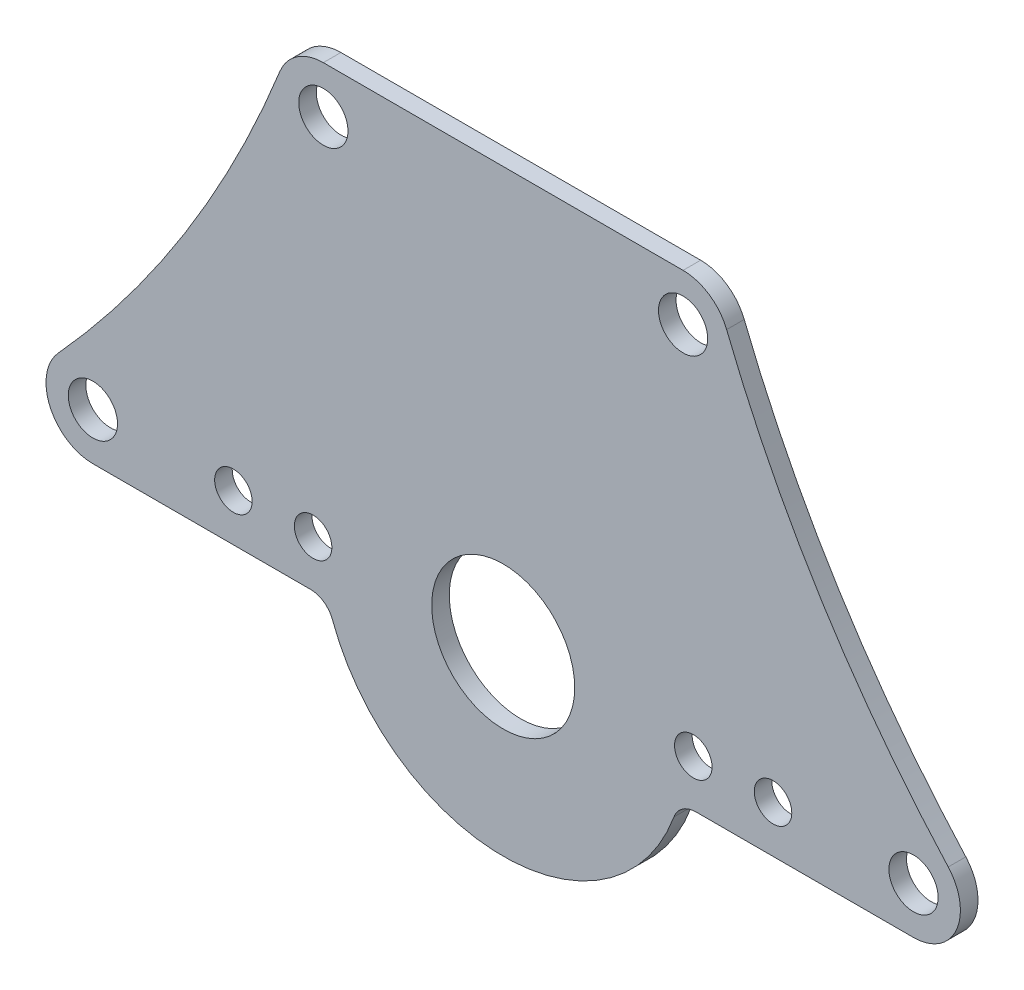
ISO-10303-21;
HEADER;
FILE_DESCRIPTION(('STEP AP214'),'2;1');
FILE_NAME('part.step','',(''),(''),'','','');
FILE_SCHEMA(('AUTOMOTIVE_DESIGN { 1 0 10303 214 1 1 1 1 }'));
ENDSEC;
DATA;
#1=APPLICATION_CONTEXT('core data for automotive mechanical design processes');
#2=APPLICATION_PROTOCOL_DEFINITION('international standard','automotive_design',2000,#1);
#3=PRODUCT_CONTEXT('',#1,'mechanical');
#4=PRODUCT('Part','Part','',(#3));
#5=PRODUCT_RELATED_PRODUCT_CATEGORY('part','',(#4));
#6=PRODUCT_DEFINITION_FORMATION('','',#4);
#7=PRODUCT_DEFINITION_CONTEXT('part definition',#1,'design');
#8=PRODUCT_DEFINITION('design','',#6,#7);
#9=PRODUCT_DEFINITION_SHAPE('','',#8);
#10=(LENGTH_UNIT() NAMED_UNIT(*) SI_UNIT(.MILLI.,.METRE.));
#11=(NAMED_UNIT(*) PLANE_ANGLE_UNIT() SI_UNIT($,.RADIAN.));
#12=(NAMED_UNIT(*) SI_UNIT($,.STERADIAN.) SOLID_ANGLE_UNIT());
#13=UNCERTAINTY_MEASURE_WITH_UNIT(LENGTH_MEASURE(1.E-05),#10,'distance_accuracy_value','');
#14=(GEOMETRIC_REPRESENTATION_CONTEXT(3) GLOBAL_UNCERTAINTY_ASSIGNED_CONTEXT((#13)) GLOBAL_UNIT_ASSIGNED_CONTEXT((#10,
#11,#12)) REPRESENTATION_CONTEXT('',''));
#15=CARTESIAN_POINT('',(0.,0.,0.));
#16=DIRECTION('',(0.,0.,1.));
#17=DIRECTION('',(1.,0.,0.));
#18=AXIS2_PLACEMENT_3D('',#15,#16,#17);
#19=CARTESIAN_POINT('',(0.,-20.,1.5));
#20=DIRECTION('',(0.,0.,-1.));
#21=DIRECTION('',(-1.,0.,0.));
#22=AXIS2_PLACEMENT_3D('',#19,#20,#21);
#23=CYLINDRICAL_SURFACE('',#22,15.5);
#24=CARTESIAN_POINT('',(0.,-20.,0.));
#25=DIRECTION('',(0.,0.,1.));
#26=DIRECTION('',(1.,0.,0.));
#27=AXIS2_PLACEMENT_3D('',#24,#25,#26);
#28=CIRCLE('',#27,15.5);
#29=CARTESIAN_POINT('',(-14.5605071115995,-25.3142857142857,0.));
#30=VERTEX_POINT('',#29);
#31=CARTESIAN_POINT('',(14.5605071115995,-25.3142857142857,0.));
#32=VERTEX_POINT('',#31);
#33=EDGE_CURVE('E220',#30,#32,#28,.T.);
#34=ORIENTED_EDGE('',*,*,#33,.T.);
#35=DIRECTION('',(0.,0.,-1.));
#36=VECTOR('',#35,1.);
#37=CARTESIAN_POINT('',(14.5605071115995,-25.3142857142857,1.5));
#38=LINE('',#37,#36);
#39=CARTESIAN_POINT('',(14.5605071115995,-25.3142857142857,1.5));
#40=VERTEX_POINT('',#39);
#41=EDGE_CURVE('E282',#32,#40,#38,.F.);
#42=ORIENTED_EDGE('',*,*,#41,.T.);
#43=CARTESIAN_POINT('',(0.,-20.,1.5));
#44=DIRECTION('',(0.,0.,1.));
#45=DIRECTION('',(1.,0.,0.));
#46=AXIS2_PLACEMENT_3D('',#43,#44,#45);
#47=CIRCLE('',#46,15.5);
#48=CARTESIAN_POINT('',(-14.5605071115995,-25.3142857142857,1.5));
#49=VERTEX_POINT('',#48);
#50=EDGE_CURVE('E139',#49,#40,#47,.T.);
#51=ORIENTED_EDGE('',*,*,#50,.F.);
#52=DIRECTION('',(0.,0.,-1.));
#53=VECTOR('',#52,1.);
#54=CARTESIAN_POINT('',(-14.5605071115995,-25.3142857142857,1.5));
#55=LINE('',#54,#53);
#56=EDGE_CURVE('E289',#49,#30,#55,.T.);
#57=ORIENTED_EDGE('',*,*,#56,.T.);
#58=EDGE_LOOP('',(#34,#42,#51,#57));
#59=FACE_BOUND('',#58,.T.);
#60=ADVANCED_FACE('F37',(#59),#23,.T.);
#61=CARTESIAN_POINT('',(0.,-24.,1.5));
#62=DIRECTION('',(0.,1.,0.));
#63=DIRECTION('',(-1.,0.,0.));
#64=AXIS2_PLACEMENT_3D('',#61,#62,#63);
#65=PLANE('',#64);
#66=DIRECTION('',(1.,0.,0.));
#67=VECTOR('',#66,1.);
#68=CARTESIAN_POINT('',(0.,-24.,1.5));
#69=LINE('',#68,#67);
#70=CARTESIAN_POINT('',(16.4392822227736,-24.,1.5));
#71=VERTEX_POINT('',#70);
#72=CARTESIAN_POINT('',(35.,-24.,1.5));
#73=VERTEX_POINT('',#72);
#74=EDGE_CURVE('E125',#71,#73,#69,.T.);
#75=ORIENTED_EDGE('',*,*,#74,.F.);
#76=DIRECTION('',(0.,0.,1.));
#77=VECTOR('',#76,1.);
#78=CARTESIAN_POINT('',(16.4392822227736,-24.,0.));
#79=LINE('',#78,#77);
#80=CARTESIAN_POINT('',(16.4392822227736,-24.,0.));
#81=VERTEX_POINT('',#80);
#82=EDGE_CURVE('E149',#71,#81,#79,.F.);
#83=ORIENTED_EDGE('',*,*,#82,.T.);
#84=DIRECTION('',(1.,0.,0.));
#85=VECTOR('',#84,1.);
#86=CARTESIAN_POINT('',(0.,-24.,0.));
#87=LINE('',#86,#85);
#88=CARTESIAN_POINT('',(35.,-24.,0.));
#89=VERTEX_POINT('',#88);
#90=EDGE_CURVE('E145',#81,#89,#87,.T.);
#91=ORIENTED_EDGE('',*,*,#90,.T.);
#92=DIRECTION('',(0.,0.,-1.));
#93=VECTOR('',#92,1.);
#94=CARTESIAN_POINT('',(35.,-24.,1.5));
#95=LINE('',#94,#93);
#96=EDGE_CURVE('E142',#73,#89,#95,.T.);
#97=ORIENTED_EDGE('',*,*,#96,.F.);
#98=EDGE_LOOP('',(#75,#83,#91,#97));
#99=FACE_BOUND('',#98,.T.);
#100=ADVANCED_FACE('F143',(#99),#65,.F.);
#101=CARTESIAN_POINT('',(35.,-20.,1.5));
#102=DIRECTION('',(0.,0.,-1.));
#103=DIRECTION('',(-1.,0.,0.));
#104=AXIS2_PLACEMENT_3D('',#101,#102,#103);
#105=CYLINDRICAL_SURFACE('',#104,4.00000000000001);
#106=CARTESIAN_POINT('',(35.,-20.,0.));
#107=DIRECTION('',(0.,0.,1.));
#108=DIRECTION('',(1.,0.,0.));
#109=AXIS2_PLACEMENT_3D('',#106,#107,#108);
#110=CIRCLE('',#109,4.00000000000001);
#111=CARTESIAN_POINT('',(37.9597935701072,-17.3093454286453,0.));
#112=VERTEX_POINT('',#111);
#113=EDGE_CURVE('E341',#89,#112,#110,.T.);
#114=ORIENTED_EDGE('',*,*,#113,.T.);
#115=DIRECTION('',(0.,0.,-1.));
#116=VECTOR('',#115,1.);
#117=CARTESIAN_POINT('',(37.9597935701072,-17.3093454286453,1.5));
#118=LINE('',#117,#116);
#119=CARTESIAN_POINT('',(37.9597935701072,-17.3093454286453,1.5));
#120=VERTEX_POINT('',#119);
#121=EDGE_CURVE('E150',#120,#112,#118,.T.);
#122=ORIENTED_EDGE('',*,*,#121,.F.);
#123=CARTESIAN_POINT('',(35.,-20.,1.5));
#124=DIRECTION('',(0.,0.,1.));
#125=DIRECTION('',(1.,0.,0.));
#126=AXIS2_PLACEMENT_3D('',#123,#124,#125);
#127=CIRCLE('',#126,4.00000000000001);
#128=EDGE_CURVE('E131',#73,#120,#127,.T.);
#129=ORIENTED_EDGE('',*,*,#128,.F.);
#130=ORIENTED_EDGE('',*,*,#96,.T.);
#131=EDGE_LOOP('',(#114,#122,#129,#130));
#132=FACE_BOUND('',#131,.T.);
#133=ADVANCED_FACE('F152',(#132),#105,.T.);
#134=CARTESIAN_POINT('',(111.954632822788,49.9570188552223,1.5));
#135=DIRECTION('',(0.,0.,-1.));
#136=DIRECTION('',(-1.,0.,0.));
#137=AXIS2_PLACEMENT_3D('',#134,#135,#136);
#138=CYLINDRICAL_SURFACE('',#137,100.);
#139=CARTESIAN_POINT('',(111.954632822788,49.9570188552223,0.));
#140=DIRECTION('',(0.,0.,1.));
#141=DIRECTION('',(1.,0.,0.));
#142=AXIS2_PLACEMENT_3D('',#139,#140,#141);
#143=CIRCLE('',#142,100.);
#144=CARTESIAN_POINT('',(19.0588225485857,12.9385311294998,0.));
#145=VERTEX_POINT('',#144);
#146=EDGE_CURVE('E338',#145,#112,#143,.T.);
#147=ORIENTED_EDGE('',*,*,#146,.F.);
#148=DIRECTION('',(0.,0.,-1.));
#149=VECTOR('',#148,1.);
#150=CARTESIAN_POINT('',(19.0588225485857,12.9385311294998,1.5));
#151=LINE('',#150,#149);
#152=CARTESIAN_POINT('',(19.0588225485857,12.9385311294998,1.5));
#153=VERTEX_POINT('',#152);
#154=EDGE_CURVE('E294',#153,#145,#151,.T.);
#155=ORIENTED_EDGE('',*,*,#154,.F.);
#156=CARTESIAN_POINT('',(111.954632822788,49.9570188552223,1.5));
#157=DIRECTION('',(0.,0.,1.));
#158=DIRECTION('',(1.,0.,0.));
#159=AXIS2_PLACEMENT_3D('',#156,#157,#158);
#160=CIRCLE('',#159,100.);
#161=EDGE_CURVE('E154',#153,#120,#160,.T.);
#162=ORIENTED_EDGE('',*,*,#161,.T.);
#163=ORIENTED_EDGE('',*,*,#121,.T.);
#164=EDGE_LOOP('',(#147,#155,#162,#163));
#165=FACE_BOUND('',#164,.T.);
#166=ADVANCED_FACE('F413',(#165),#138,.F.);
#167=CARTESIAN_POINT('',(15.3429901376176,11.4577916204709,1.5));
#168=DIRECTION('',(0.,0.,-1.));
#169=DIRECTION('',(-1.,0.,0.));
#170=AXIS2_PLACEMENT_3D('',#167,#168,#169);
#171=CYLINDRICAL_SURFACE('',#170,4.00000000000002);
#172=CARTESIAN_POINT('',(15.3429901376176,11.4577916204709,0.));
#173=DIRECTION('',(0.,0.,1.));
#174=DIRECTION('',(1.,0.,0.));
#175=AXIS2_PLACEMENT_3D('',#172,#173,#174);
#176=CIRCLE('',#175,4.00000000000002);
#177=CARTESIAN_POINT('',(15.3429901376176,15.4577916204709,0.));
#178=VERTEX_POINT('',#177);
#179=EDGE_CURVE('E335',#145,#178,#176,.T.);
#180=ORIENTED_EDGE('',*,*,#179,.T.);
#181=DIRECTION('',(0.,0.,-1.));
#182=VECTOR('',#181,1.);
#183=CARTESIAN_POINT('',(15.3429901376176,15.4577916204709,1.5));
#184=LINE('',#183,#182);
#185=CARTESIAN_POINT('',(15.3429901376176,15.4577916204709,1.5));
#186=VERTEX_POINT('',#185);
#187=EDGE_CURVE('E296',#186,#178,#184,.T.);
#188=ORIENTED_EDGE('',*,*,#187,.F.);
#189=CARTESIAN_POINT('',(15.3429901376176,11.4577916204709,1.5));
#190=DIRECTION('',(0.,0.,1.));
#191=DIRECTION('',(1.,0.,0.));
#192=AXIS2_PLACEMENT_3D('',#189,#190,#191);
#193=CIRCLE('',#192,4.00000000000002);
#194=EDGE_CURVE('E156',#153,#186,#193,.T.);
#195=ORIENTED_EDGE('',*,*,#194,.F.);
#196=ORIENTED_EDGE('',*,*,#154,.T.);
#197=EDGE_LOOP('',(#180,#188,#195,#196));
#198=FACE_BOUND('',#197,.T.);
#199=ADVANCED_FACE('F409',(#198),#171,.T.);
#200=CARTESIAN_POINT('',(0.,15.4577916204709,1.5));
#201=DIRECTION('',(0.,1.,0.));
#202=DIRECTION('',(0.,0.,1.));
#203=AXIS2_PLACEMENT_3D('',#200,#201,#202);
#204=PLANE('',#203);
#205=DIRECTION('',(1.,0.,0.));
#206=VECTOR('',#205,1.);
#207=CARTESIAN_POINT('',(0.,15.4577916204709,0.));
#208=LINE('',#207,#206);
#209=CARTESIAN_POINT('',(-15.3429901376176,15.4577916204709,0.));
#210=VERTEX_POINT('',#209);
#211=EDGE_CURVE('E332',#210,#178,#208,.T.);
#212=ORIENTED_EDGE('',*,*,#211,.F.);
#213=DIRECTION('',(0.,0.,-1.));
#214=VECTOR('',#213,1.);
#215=CARTESIAN_POINT('',(-15.3429901376176,15.4577916204709,1.5));
#216=LINE('',#215,#214);
#217=CARTESIAN_POINT('',(-15.3429901376176,15.4577916204709,1.5));
#218=VERTEX_POINT('',#217);
#219=EDGE_CURVE('E298',#218,#210,#216,.T.);
#220=ORIENTED_EDGE('',*,*,#219,.F.);
#221=DIRECTION('',(1.,0.,0.));
#222=VECTOR('',#221,1.);
#223=CARTESIAN_POINT('',(0.,15.4577916204709,1.5));
#224=LINE('',#223,#222);
#225=EDGE_CURVE('E172',#218,#186,#224,.T.);
#226=ORIENTED_EDGE('',*,*,#225,.T.);
#227=ORIENTED_EDGE('',*,*,#187,.T.);
#228=EDGE_LOOP('',(#212,#220,#226,#227));
#229=FACE_BOUND('',#228,.T.);
#230=ADVANCED_FACE('F405',(#229),#204,.T.);
#231=CARTESIAN_POINT('',(-15.3429901376176,11.4577916204709,1.5));
#232=DIRECTION('',(0.,0.,-1.));
#233=DIRECTION('',(-1.,0.,0.));
#234=AXIS2_PLACEMENT_3D('',#231,#232,#233);
#235=CYLINDRICAL_SURFACE('',#234,4.00000000000002);
#236=CARTESIAN_POINT('',(-15.3429901376176,11.4577916204709,0.));
#237=DIRECTION('',(0.,0.,1.));
#238=DIRECTION('',(1.,0.,0.));
#239=AXIS2_PLACEMENT_3D('',#236,#237,#238);
#240=CIRCLE('',#239,4.00000000000002);
#241=CARTESIAN_POINT('',(-19.0588225485857,12.9385311294998,0.));
#242=VERTEX_POINT('',#241);
#243=EDGE_CURVE('E329',#242,#210,#240,.F.);
#244=ORIENTED_EDGE('',*,*,#243,.F.);
#245=DIRECTION('',(0.,0.,-1.));
#246=VECTOR('',#245,1.);
#247=CARTESIAN_POINT('',(-19.0588225485857,12.9385311294998,1.5));
#248=LINE('',#247,#246);
#249=CARTESIAN_POINT('',(-19.0588225485857,12.9385311294998,1.5));
#250=VERTEX_POINT('',#249);
#251=EDGE_CURVE('E300',#250,#242,#248,.T.);
#252=ORIENTED_EDGE('',*,*,#251,.F.);
#253=CARTESIAN_POINT('',(-15.3429901376176,11.4577916204709,1.5));
#254=DIRECTION('',(0.,0.,1.));
#255=DIRECTION('',(1.,0.,0.));
#256=AXIS2_PLACEMENT_3D('',#253,#254,#255);
#257=CIRCLE('',#256,4.00000000000002);
#258=EDGE_CURVE('E176',#250,#218,#257,.F.);
#259=ORIENTED_EDGE('',*,*,#258,.T.);
#260=ORIENTED_EDGE('',*,*,#219,.T.);
#261=EDGE_LOOP('',(#244,#252,#259,#260));
#262=FACE_BOUND('',#261,.T.);
#263=ADVANCED_FACE('F401',(#262),#235,.T.);
#264=CARTESIAN_POINT('',(-111.954632822788,49.9570188552223,1.5));
#265=DIRECTION('',(0.,0.,-1.));
#266=DIRECTION('',(-1.,0.,0.));
#267=AXIS2_PLACEMENT_3D('',#264,#265,#266);
#268=CYLINDRICAL_SURFACE('',#267,100.);
#269=CARTESIAN_POINT('',(-111.954632822788,49.9570188552223,0.));
#270=DIRECTION('',(0.,0.,1.));
#271=DIRECTION('',(1.,0.,0.));
#272=AXIS2_PLACEMENT_3D('',#269,#270,#271);
#273=CIRCLE('',#272,100.);
#274=CARTESIAN_POINT('',(-37.9597935701072,-17.3093454286453,0.));
#275=VERTEX_POINT('',#274);
#276=EDGE_CURVE('E326',#242,#275,#273,.F.);
#277=ORIENTED_EDGE('',*,*,#276,.T.);
#278=DIRECTION('',(0.,0.,-1.));
#279=VECTOR('',#278,1.);
#280=CARTESIAN_POINT('',(-37.9597935701072,-17.3093454286453,1.5));
#281=LINE('',#280,#279);
#282=CARTESIAN_POINT('',(-37.9597935701072,-17.3093454286453,1.5));
#283=VERTEX_POINT('',#282);
#284=EDGE_CURVE('E302',#283,#275,#281,.T.);
#285=ORIENTED_EDGE('',*,*,#284,.F.);
#286=CARTESIAN_POINT('',(-111.954632822788,49.9570188552223,1.5));
#287=DIRECTION('',(0.,0.,1.));
#288=DIRECTION('',(1.,0.,0.));
#289=AXIS2_PLACEMENT_3D('',#286,#287,#288);
#290=CIRCLE('',#289,100.);
#291=EDGE_CURVE('E179',#250,#283,#290,.F.);
#292=ORIENTED_EDGE('',*,*,#291,.F.);
#293=ORIENTED_EDGE('',*,*,#251,.T.);
#294=EDGE_LOOP('',(#277,#285,#292,#293));
#295=FACE_BOUND('',#294,.T.);
#296=ADVANCED_FACE('F397',(#295),#268,.F.);
#297=CARTESIAN_POINT('',(-35.,-20.,1.5));
#298=DIRECTION('',(0.,0.,-1.));
#299=DIRECTION('',(-1.,0.,0.));
#300=AXIS2_PLACEMENT_3D('',#297,#298,#299);
#301=CYLINDRICAL_SURFACE('',#300,4.00000000000001);
#302=CARTESIAN_POINT('',(-35.,-20.,0.));
#303=DIRECTION('',(0.,0.,1.));
#304=DIRECTION('',(1.,0.,0.));
#305=AXIS2_PLACEMENT_3D('',#302,#303,#304);
#306=CIRCLE('',#305,4.00000000000001);
#307=CARTESIAN_POINT('',(-35.,-24.,0.));
#308=VERTEX_POINT('',#307);
#309=EDGE_CURVE('E323',#308,#275,#306,.F.);
#310=ORIENTED_EDGE('',*,*,#309,.F.);
#311=DIRECTION('',(0.,0.,-1.));
#312=VECTOR('',#311,1.);
#313=CARTESIAN_POINT('',(-35.,-24.,1.5));
#314=LINE('',#313,#312);
#315=CARTESIAN_POINT('',(-35.,-24.,1.5));
#316=VERTEX_POINT('',#315);
#317=EDGE_CURVE('E304',#316,#308,#314,.T.);
#318=ORIENTED_EDGE('',*,*,#317,.F.);
#319=CARTESIAN_POINT('',(-35.,-20.,1.5));
#320=DIRECTION('',(0.,0.,1.));
#321=DIRECTION('',(1.,0.,0.));
#322=AXIS2_PLACEMENT_3D('',#319,#320,#321);
#323=CIRCLE('',#322,4.00000000000001);
#324=EDGE_CURVE('E181',#316,#283,#323,.F.);
#325=ORIENTED_EDGE('',*,*,#324,.T.);
#326=ORIENTED_EDGE('',*,*,#284,.T.);
#327=EDGE_LOOP('',(#310,#318,#325,#326));
#328=FACE_BOUND('',#327,.T.);
#329=ADVANCED_FACE('F384',(#328),#301,.T.);
#330=CARTESIAN_POINT('',(35.,-20.,1.5));
#331=DIRECTION('',(0.,0.,-1.));
#332=DIRECTION('',(-1.,0.,0.));
#333=AXIS2_PLACEMENT_3D('',#330,#331,#332);
#334=CYLINDRICAL_SURFACE('',#333,2.1);
#335=CARTESIAN_POINT('',(35.,-20.,1.5));
#336=DIRECTION('',(0.,0.,1.));
#337=DIRECTION('',(1.,0.,0.));
#338=AXIS2_PLACEMENT_3D('',#335,#336,#337);
#339=CIRCLE('',#338,2.1);
#340=CARTESIAN_POINT('',(37.1,-20.,1.5));
#341=VERTEX_POINT('',#340);
#342=EDGE_CURVE('E346',#341,#341,#339,.T.);
#343=ORIENTED_EDGE('',*,*,#342,.T.);
#344=EDGE_LOOP('',(#343));
#345=FACE_BOUND('',#344,.T.);
#346=CARTESIAN_POINT('',(35.,-20.,0.));
#347=DIRECTION('',(0.,0.,1.));
#348=DIRECTION('',(1.,0.,0.));
#349=AXIS2_PLACEMENT_3D('',#346,#347,#348);
#350=CIRCLE('',#349,2.1);
#351=CARTESIAN_POINT('',(37.1,-20.,0.));
#352=VERTEX_POINT('',#351);
#353=EDGE_CURVE('E309',#352,#352,#350,.T.);
#354=ORIENTED_EDGE('',*,*,#353,.F.);
#355=EDGE_LOOP('',(#354));
#356=FACE_BOUND('',#355,.T.);
#357=ADVANCED_FACE('F380',(#345,#356),#334,.F.);
#358=CARTESIAN_POINT('',(15.3429901376176,11.4577916204709,1.5));
#359=DIRECTION('',(0.,0.,-1.));
#360=DIRECTION('',(-1.,0.,0.));
#361=AXIS2_PLACEMENT_3D('',#358,#359,#360);
#362=CYLINDRICAL_SURFACE('',#361,2.09999999999999);
#363=CARTESIAN_POINT('',(15.3429901376176,11.4577916204709,1.5));
#364=DIRECTION('',(0.,0.,1.));
#365=DIRECTION('',(1.,0.,0.));
#366=AXIS2_PLACEMENT_3D('',#363,#364,#365);
#367=CIRCLE('',#366,2.09999999999999);
#368=CARTESIAN_POINT('',(17.4429901376176,11.4577916204709,1.5));
#369=VERTEX_POINT('',#368);
#370=EDGE_CURVE('E350',#369,#369,#367,.T.);
#371=ORIENTED_EDGE('',*,*,#370,.T.);
#372=EDGE_LOOP('',(#371));
#373=FACE_BOUND('',#372,.T.);
#374=CARTESIAN_POINT('',(15.3429901376176,11.4577916204709,0.));
#375=DIRECTION('',(0.,0.,1.));
#376=DIRECTION('',(1.,0.,0.));
#377=AXIS2_PLACEMENT_3D('',#374,#375,#376);
#378=CIRCLE('',#377,2.09999999999999);
#379=CARTESIAN_POINT('',(17.4429901376176,11.4577916204709,0.));
#380=VERTEX_POINT('',#379);
#381=EDGE_CURVE('E312',#380,#380,#378,.T.);
#382=ORIENTED_EDGE('',*,*,#381,.F.);
#383=EDGE_LOOP('',(#382));
#384=FACE_BOUND('',#383,.T.);
#385=ADVANCED_FACE('F383',(#373,#384),#362,.F.);
#386=CARTESIAN_POINT('',(-15.3429901376176,11.4577916204709,1.5));
#387=DIRECTION('',(0.,0.,-1.));
#388=DIRECTION('',(-1.,0.,0.));
#389=AXIS2_PLACEMENT_3D('',#386,#387,#388);
#390=CYLINDRICAL_SURFACE('',#389,2.1);
#391=CARTESIAN_POINT('',(-15.3429901376176,11.4577916204709,1.5));
#392=DIRECTION('',(0.,0.,1.));
#393=DIRECTION('',(1.,0.,0.));
#394=AXIS2_PLACEMENT_3D('',#391,#392,#393);
#395=CIRCLE('',#394,2.1);
#396=CARTESIAN_POINT('',(-13.2429901376176,11.4577916204709,1.5));
#397=VERTEX_POINT('',#396);
#398=EDGE_CURVE('E353',#397,#397,#395,.F.);
#399=ORIENTED_EDGE('',*,*,#398,.F.);
#400=EDGE_LOOP('',(#399));
#401=FACE_BOUND('',#400,.T.);
#402=CARTESIAN_POINT('',(-15.3429901376176,11.4577916204709,0.));
#403=DIRECTION('',(0.,0.,1.));
#404=DIRECTION('',(1.,0.,0.));
#405=AXIS2_PLACEMENT_3D('',#402,#403,#404);
#406=CIRCLE('',#405,2.1);
#407=CARTESIAN_POINT('',(-13.2429901376176,11.4577916204709,0.));
#408=VERTEX_POINT('',#407);
#409=EDGE_CURVE('E315',#408,#408,#406,.F.);
#410=ORIENTED_EDGE('',*,*,#409,.T.);
#411=EDGE_LOOP('',(#410));
#412=FACE_BOUND('',#411,.T.);
#413=ADVANCED_FACE('F388',(#401,#412),#390,.F.);
#414=CARTESIAN_POINT('',(0.,-20.,1.5));
#415=DIRECTION('',(0.,0.,-1.));
#416=DIRECTION('',(-1.,0.,0.));
#417=AXIS2_PLACEMENT_3D('',#414,#415,#416);
#418=CYLINDRICAL_SURFACE('',#417,6.1);
#419=CARTESIAN_POINT('',(0.,-20.,1.5));
#420=DIRECTION('',(0.,0.,1.));
#421=DIRECTION('',(1.,0.,0.));
#422=AXIS2_PLACEMENT_3D('',#419,#420,#421);
#423=CIRCLE('',#422,6.1);
#424=CARTESIAN_POINT('',(6.1,-20.,1.5));
#425=VERTEX_POINT('',#424);
#426=EDGE_CURVE('E187',#425,#425,#423,.T.);
#427=ORIENTED_EDGE('',*,*,#426,.T.);
#428=EDGE_LOOP('',(#427));
#429=FACE_BOUND('',#428,.T.);
#430=CARTESIAN_POINT('',(0.,-20.,0.));
#431=DIRECTION('',(0.,0.,1.));
#432=DIRECTION('',(1.,0.,0.));
#433=AXIS2_PLACEMENT_3D('',#430,#431,#432);
#434=CIRCLE('',#433,6.1);
#435=CARTESIAN_POINT('',(6.1,-20.,0.));
#436=VERTEX_POINT('',#435);
#437=EDGE_CURVE('E318',#436,#436,#434,.T.);
#438=ORIENTED_EDGE('',*,*,#437,.F.);
#439=EDGE_LOOP('',(#438));
#440=FACE_BOUND('',#439,.T.);
#441=ADVANCED_FACE('F360',(#429,#440),#418,.F.);
#442=CARTESIAN_POINT('',(0.,-24.,1.5));
#443=DIRECTION('',(0.,1.,0.));
#444=DIRECTION('',(-1.,0.,0.));
#445=AXIS2_PLACEMENT_3D('',#442,#443,#444);
#446=PLANE('',#445);
#447=DIRECTION('',(1.,0.,0.));
#448=VECTOR('',#447,1.);
#449=CARTESIAN_POINT('',(0.,-24.,0.));
#450=LINE('',#449,#448);
#451=CARTESIAN_POINT('',(-16.4392822227736,-24.,0.));
#452=VERTEX_POINT('',#451);
#453=EDGE_CURVE('E321',#308,#452,#450,.T.);
#454=ORIENTED_EDGE('',*,*,#453,.T.);
#455=DIRECTION('',(0.,0.,1.));
#456=VECTOR('',#455,1.);
#457=CARTESIAN_POINT('',(-16.4392822227736,-24.,1.5));
#458=LINE('',#457,#456);
#459=CARTESIAN_POINT('',(-16.4392822227736,-24.,1.5));
#460=VERTEX_POINT('',#459);
#461=EDGE_CURVE('E52',#452,#460,#458,.T.);
#462=ORIENTED_EDGE('',*,*,#461,.T.);
#463=DIRECTION('',(1.,0.,0.));
#464=VECTOR('',#463,1.);
#465=CARTESIAN_POINT('',(0.,-24.,1.5));
#466=LINE('',#465,#464);
#467=EDGE_CURVE('E184',#316,#460,#466,.T.);
#468=ORIENTED_EDGE('',*,*,#467,.F.);
#469=ORIENTED_EDGE('',*,*,#317,.T.);
#470=EDGE_LOOP('',(#454,#462,#468,#469));
#471=FACE_BOUND('',#470,.T.);
#472=ADVANCED_FACE('F371',(#471),#446,.F.);
#473=CARTESIAN_POINT('',(-35.,-20.,1.5));
#474=DIRECTION('',(0.,0.,-1.));
#475=DIRECTION('',(-1.,0.,0.));
#476=AXIS2_PLACEMENT_3D('',#473,#474,#475);
#477=CYLINDRICAL_SURFACE('',#476,2.1);
#478=CARTESIAN_POINT('',(-35.,-20.,1.5));
#479=DIRECTION('',(0.,0.,1.));
#480=DIRECTION('',(1.,0.,0.));
#481=AXIS2_PLACEMENT_3D('',#478,#479,#480);
#482=CIRCLE('',#481,2.1);
#483=CARTESIAN_POINT('',(-32.9,-20.,1.5));
#484=VERTEX_POINT('',#483);
#485=EDGE_CURVE('E306',#484,#484,#482,.F.);
#486=ORIENTED_EDGE('',*,*,#485,.F.);
#487=EDGE_LOOP('',(#486));
#488=FACE_BOUND('',#487,.T.);
#489=CARTESIAN_POINT('',(-35.,-20.,0.));
#490=DIRECTION('',(0.,0.,1.));
#491=DIRECTION('',(1.,0.,0.));
#492=AXIS2_PLACEMENT_3D('',#489,#490,#491);
#493=CIRCLE('',#492,2.1);
#494=CARTESIAN_POINT('',(-32.9,-20.,0.));
#495=VERTEX_POINT('',#494);
#496=EDGE_CURVE('E196',#495,#495,#493,.F.);
#497=ORIENTED_EDGE('',*,*,#496,.T.);
#498=EDGE_LOOP('',(#497));
#499=FACE_BOUND('',#498,.T.);
#500=ADVANCED_FACE('F242',(#488,#499),#477,.F.);
#501=CARTESIAN_POINT('',(0.,0.,1.5));
#502=DIRECTION('',(0.,0.,1.));
#503=DIRECTION('',(1.,0.,0.));
#504=AXIS2_PLACEMENT_3D('',#501,#502,#503);
#505=PLANE('',#504);
#506=CARTESIAN_POINT('',(23.015,-20.,1.5));
#507=DIRECTION('',(0.,0.,1.));
#508=DIRECTION('',(1.,0.,0.));
#509=AXIS2_PLACEMENT_3D('',#506,#507,#508);
#510=CIRCLE('',#509,1.6);
#511=CARTESIAN_POINT('',(24.615,-20.,1.5));
#512=VERTEX_POINT('',#511);
#513=EDGE_CURVE('E221',#512,#512,#510,.T.);
#514=ORIENTED_EDGE('',*,*,#513,.F.);
#515=EDGE_LOOP('',(#514));
#516=FACE_BOUND('',#515,.T.);
#517=CARTESIAN_POINT('',(-23.015,-20.,1.5));
#518=DIRECTION('',(0.,0.,1.));
#519=DIRECTION('',(-1.,0.,0.));
#520=AXIS2_PLACEMENT_3D('',#517,#518,#519);
#521=CIRCLE('',#520,1.6);
#522=CARTESIAN_POINT('',(-24.615,-20.,1.5));
#523=VERTEX_POINT('',#522);
#524=EDGE_CURVE('E197',#523,#523,#521,.T.);
#525=ORIENTED_EDGE('',*,*,#524,.F.);
#526=EDGE_LOOP('',(#525));
#527=FACE_BOUND('',#526,.T.);
#528=CARTESIAN_POINT('',(16.215,-20.,1.5));
#529=DIRECTION('',(0.,0.,1.));
#530=DIRECTION('',(1.,0.,0.));
#531=AXIS2_PLACEMENT_3D('',#528,#529,#530);
#532=CIRCLE('',#531,1.6);
#533=CARTESIAN_POINT('',(17.815,-20.,1.5));
#534=VERTEX_POINT('',#533);
#535=EDGE_CURVE('E207',#534,#534,#532,.T.);
#536=ORIENTED_EDGE('',*,*,#535,.F.);
#537=EDGE_LOOP('',(#536));
#538=FACE_BOUND('',#537,.T.);
#539=CARTESIAN_POINT('',(-16.215,-20.,1.5));
#540=DIRECTION('',(0.,0.,1.));
#541=DIRECTION('',(-1.,0.,0.));
#542=AXIS2_PLACEMENT_3D('',#539,#540,#541);
#543=CIRCLE('',#542,1.6);
#544=CARTESIAN_POINT('',(-17.815,-20.,1.5));
#545=VERTEX_POINT('',#544);
#546=EDGE_CURVE('E214',#545,#545,#543,.T.);
#547=ORIENTED_EDGE('',*,*,#546,.F.);
#548=EDGE_LOOP('',(#547));
#549=FACE_BOUND('',#548,.T.);
#550=ORIENTED_EDGE('',*,*,#467,.T.);
#551=CARTESIAN_POINT('',(-16.4392822227736,-26.,1.5));
#552=DIRECTION('',(0.,0.,1.));
#553=DIRECTION('',(1.,0.,0.));
#554=AXIS2_PLACEMENT_3D('',#551,#552,#553);
#555=CIRCLE('',#554,2.);
#556=EDGE_CURVE('E12',#460,#49,#555,.F.);
#557=ORIENTED_EDGE('',*,*,#556,.T.);
#558=ORIENTED_EDGE('',*,*,#50,.T.);
#559=CARTESIAN_POINT('',(16.4392822227736,-26.,1.5));
#560=DIRECTION('',(0.,0.,1.));
#561=DIRECTION('',(1.,0.,0.));
#562=AXIS2_PLACEMENT_3D('',#559,#560,#561);
#563=CIRCLE('',#562,2.);
#564=EDGE_CURVE('E135',#40,#71,#563,.F.);
#565=ORIENTED_EDGE('',*,*,#564,.T.);
#566=ORIENTED_EDGE('',*,*,#74,.T.);
#567=ORIENTED_EDGE('',*,*,#128,.T.);
#568=ORIENTED_EDGE('',*,*,#161,.F.);
#569=ORIENTED_EDGE('',*,*,#194,.T.);
#570=ORIENTED_EDGE('',*,*,#225,.F.);
#571=ORIENTED_EDGE('',*,*,#258,.F.);
#572=ORIENTED_EDGE('',*,*,#291,.T.);
#573=ORIENTED_EDGE('',*,*,#324,.F.);
#574=EDGE_LOOP('',(#550,#557,#558,#565,#566,#567,#568,#569,#570,#571,#572,#573));
#575=FACE_BOUND('',#574,.T.);
#576=ORIENTED_EDGE('',*,*,#426,.F.);
#577=EDGE_LOOP('',(#576));
#578=FACE_BOUND('',#577,.T.);
#579=ORIENTED_EDGE('',*,*,#398,.T.);
#580=EDGE_LOOP('',(#579));
#581=FACE_BOUND('',#580,.T.);
#582=ORIENTED_EDGE('',*,*,#370,.F.);
#583=EDGE_LOOP('',(#582));
#584=FACE_BOUND('',#583,.T.);
#585=ORIENTED_EDGE('',*,*,#342,.F.);
#586=EDGE_LOOP('',(#585));
#587=FACE_BOUND('',#586,.T.);
#588=ORIENTED_EDGE('',*,*,#485,.T.);
#589=EDGE_LOOP('',(#588));
#590=FACE_BOUND('',#589,.T.);
#591=ADVANCED_FACE('F127',(#516,#527,#538,#549,#575,#578,#581,#584,#587,#590),#505,.T.);
#592=CARTESIAN_POINT('',(0.,0.,0.));
#593=DIRECTION('',(0.,0.,1.));
#594=DIRECTION('',(1.,0.,0.));
#595=AXIS2_PLACEMENT_3D('',#592,#593,#594);
#596=PLANE('',#595);
#597=CARTESIAN_POINT('',(23.015,-20.,0.));
#598=DIRECTION('',(0.,0.,1.));
#599=DIRECTION('',(1.,0.,0.));
#600=AXIS2_PLACEMENT_3D('',#597,#598,#599);
#601=CIRCLE('',#600,1.6);
#602=CARTESIAN_POINT('',(24.615,-20.,0.));
#603=VERTEX_POINT('',#602);
#604=EDGE_CURVE('E218',#603,#603,#601,.T.);
#605=ORIENTED_EDGE('',*,*,#604,.T.);
#606=EDGE_LOOP('',(#605));
#607=FACE_BOUND('',#606,.T.);
#608=CARTESIAN_POINT('',(-23.015,-20.,0.));
#609=DIRECTION('',(0.,0.,1.));
#610=DIRECTION('',(-1.,0.,0.));
#611=AXIS2_PLACEMENT_3D('',#608,#609,#610);
#612=CIRCLE('',#611,1.6);
#613=CARTESIAN_POINT('',(-24.615,-20.,0.));
#614=VERTEX_POINT('',#613);
#615=EDGE_CURVE('E201',#614,#614,#612,.T.);
#616=ORIENTED_EDGE('',*,*,#615,.T.);
#617=EDGE_LOOP('',(#616));
#618=FACE_BOUND('',#617,.T.);
#619=CARTESIAN_POINT('',(16.215,-20.,0.));
#620=DIRECTION('',(0.,0.,1.));
#621=DIRECTION('',(1.,0.,0.));
#622=AXIS2_PLACEMENT_3D('',#619,#620,#621);
#623=CIRCLE('',#622,1.6);
#624=CARTESIAN_POINT('',(17.815,-20.,0.));
#625=VERTEX_POINT('',#624);
#626=EDGE_CURVE('E202',#625,#625,#623,.T.);
#627=ORIENTED_EDGE('',*,*,#626,.T.);
#628=EDGE_LOOP('',(#627));
#629=FACE_BOUND('',#628,.T.);
#630=CARTESIAN_POINT('',(-16.215,-20.,0.));
#631=DIRECTION('',(0.,0.,1.));
#632=DIRECTION('',(-1.,0.,0.));
#633=AXIS2_PLACEMENT_3D('',#630,#631,#632);
#634=CIRCLE('',#633,1.6);
#635=CARTESIAN_POINT('',(-17.815,-20.,0.));
#636=VERTEX_POINT('',#635);
#637=EDGE_CURVE('E212',#636,#636,#634,.T.);
#638=ORIENTED_EDGE('',*,*,#637,.T.);
#639=EDGE_LOOP('',(#638));
#640=FACE_BOUND('',#639,.T.);
#641=ORIENTED_EDGE('',*,*,#33,.F.);
#642=CARTESIAN_POINT('',(-16.4392822227736,-26.,0.));
#643=DIRECTION('',(0.,0.,1.));
#644=DIRECTION('',(1.,0.,0.));
#645=AXIS2_PLACEMENT_3D('',#642,#643,#644);
#646=CIRCLE('',#645,2.);
#647=EDGE_CURVE('E45',#30,#452,#646,.T.);
#648=ORIENTED_EDGE('',*,*,#647,.T.);
#649=ORIENTED_EDGE('',*,*,#453,.F.);
#650=ORIENTED_EDGE('',*,*,#309,.T.);
#651=ORIENTED_EDGE('',*,*,#276,.F.);
#652=ORIENTED_EDGE('',*,*,#243,.T.);
#653=ORIENTED_EDGE('',*,*,#211,.T.);
#654=ORIENTED_EDGE('',*,*,#179,.F.);
#655=ORIENTED_EDGE('',*,*,#146,.T.);
#656=ORIENTED_EDGE('',*,*,#113,.F.);
#657=ORIENTED_EDGE('',*,*,#90,.F.);
#658=CARTESIAN_POINT('',(16.4392822227736,-26.,0.));
#659=DIRECTION('',(0.,0.,1.));
#660=DIRECTION('',(1.,0.,0.));
#661=AXIS2_PLACEMENT_3D('',#658,#659,#660);
#662=CIRCLE('',#661,2.);
#663=EDGE_CURVE('E283',#81,#32,#662,.T.);
#664=ORIENTED_EDGE('',*,*,#663,.T.);
#665=EDGE_LOOP('',(#641,#648,#649,#650,#651,#652,#653,#654,#655,#656,#657,#664));
#666=FACE_BOUND('',#665,.T.);
#667=ORIENTED_EDGE('',*,*,#437,.T.);
#668=EDGE_LOOP('',(#667));
#669=FACE_BOUND('',#668,.T.);
#670=ORIENTED_EDGE('',*,*,#409,.F.);
#671=EDGE_LOOP('',(#670));
#672=FACE_BOUND('',#671,.T.);
#673=ORIENTED_EDGE('',*,*,#381,.T.);
#674=EDGE_LOOP('',(#673));
#675=FACE_BOUND('',#674,.T.);
#676=ORIENTED_EDGE('',*,*,#353,.T.);
#677=EDGE_LOOP('',(#676));
#678=FACE_BOUND('',#677,.T.);
#679=ORIENTED_EDGE('',*,*,#496,.F.);
#680=EDGE_LOOP('',(#679));
#681=FACE_BOUND('',#680,.T.);
#682=ADVANCED_FACE('F229',(#607,#618,#629,#640,#666,#669,#672,#675,#678,#681),#596,.F.);
#683=CARTESIAN_POINT('',(-16.215,-20.,0.));
#684=DIRECTION('',(0.,0.,1.));
#685=DIRECTION('',(1.,0.,0.));
#686=AXIS2_PLACEMENT_3D('',#683,#684,#685);
#687=CYLINDRICAL_SURFACE('',#686,1.6);
#688=ORIENTED_EDGE('',*,*,#637,.F.);
#689=EDGE_LOOP('',(#688));
#690=FACE_BOUND('',#689,.T.);
#691=ORIENTED_EDGE('',*,*,#546,.T.);
#692=EDGE_LOOP('',(#691));
#693=FACE_BOUND('',#692,.T.);
#694=ADVANCED_FACE('F249',(#690,#693),#687,.F.);
#695=CARTESIAN_POINT('',(16.215,-20.,0.));
#696=DIRECTION('',(0.,0.,1.));
#697=DIRECTION('',(1.,0.,0.));
#698=AXIS2_PLACEMENT_3D('',#695,#696,#697);
#699=CYLINDRICAL_SURFACE('',#698,1.6);
#700=ORIENTED_EDGE('',*,*,#626,.F.);
#701=EDGE_LOOP('',(#700));
#702=FACE_BOUND('',#701,.T.);
#703=ORIENTED_EDGE('',*,*,#535,.T.);
#704=EDGE_LOOP('',(#703));
#705=FACE_BOUND('',#704,.T.);
#706=ADVANCED_FACE('F236',(#702,#705),#699,.F.);
#707=CARTESIAN_POINT('',(-23.015,-20.,0.));
#708=DIRECTION('',(0.,0.,1.));
#709=DIRECTION('',(1.,0.,0.));
#710=AXIS2_PLACEMENT_3D('',#707,#708,#709);
#711=CYLINDRICAL_SURFACE('',#710,1.6);
#712=ORIENTED_EDGE('',*,*,#615,.F.);
#713=EDGE_LOOP('',(#712));
#714=FACE_BOUND('',#713,.T.);
#715=ORIENTED_EDGE('',*,*,#524,.T.);
#716=EDGE_LOOP('',(#715));
#717=FACE_BOUND('',#716,.T.);
#718=ADVANCED_FACE('F232',(#714,#717),#711,.F.);
#719=CARTESIAN_POINT('',(23.015,-20.,0.));
#720=DIRECTION('',(0.,0.,1.));
#721=DIRECTION('',(1.,0.,0.));
#722=AXIS2_PLACEMENT_3D('',#719,#720,#721);
#723=CYLINDRICAL_SURFACE('',#722,1.6);
#724=ORIENTED_EDGE('',*,*,#604,.F.);
#725=EDGE_LOOP('',(#724));
#726=FACE_BOUND('',#725,.T.);
#727=ORIENTED_EDGE('',*,*,#513,.T.);
#728=EDGE_LOOP('',(#727));
#729=FACE_BOUND('',#728,.T.);
#730=ADVANCED_FACE('F235',(#726,#729),#723,.F.);
#731=CARTESIAN_POINT('',(16.4392822227736,-26.,1.5));
#732=DIRECTION('',(0.,0.,-1.));
#733=DIRECTION('',(-1.,0.,0.));
#734=AXIS2_PLACEMENT_3D('',#731,#732,#733);
#735=CYLINDRICAL_SURFACE('',#734,2.);
#736=ORIENTED_EDGE('',*,*,#564,.F.);
#737=ORIENTED_EDGE('',*,*,#41,.F.);
#738=ORIENTED_EDGE('',*,*,#663,.F.);
#739=ORIENTED_EDGE('',*,*,#82,.F.);
#740=EDGE_LOOP('',(#736,#737,#738,#739));
#741=FACE_BOUND('',#740,.T.);
#742=ADVANCED_FACE('F272',(#741),#735,.F.);
#743=CARTESIAN_POINT('',(-16.4392822227736,-26.,1.5));
#744=DIRECTION('',(0.,0.,-1.));
#745=DIRECTION('',(-1.,0.,0.));
#746=AXIS2_PLACEMENT_3D('',#743,#744,#745);
#747=CYLINDRICAL_SURFACE('',#746,2.);
#748=ORIENTED_EDGE('',*,*,#556,.F.);
#749=ORIENTED_EDGE('',*,*,#461,.F.);
#750=ORIENTED_EDGE('',*,*,#647,.F.);
#751=ORIENTED_EDGE('',*,*,#56,.F.);
#752=EDGE_LOOP('',(#748,#749,#750,#751));
#753=FACE_BOUND('',#752,.T.);
#754=ADVANCED_FACE('F39',(#753),#747,.F.);
#755=CLOSED_SHELL('',(#60,#100,#133,#166,#199,#230,#263,#296,#329,#357,#385,#413,#441,#472,#500,
#591,#682,#694,#706,#718,#730,#742,#754));
#756=MANIFOLD_SOLID_BREP('B2',#755);
#757=ADVANCED_BREP_SHAPE_REPRESENTATION('',(#18,#756),#14);
#758=SHAPE_DEFINITION_REPRESENTATION(#9,#757);
ENDSEC;
END-ISO-10303-21;
